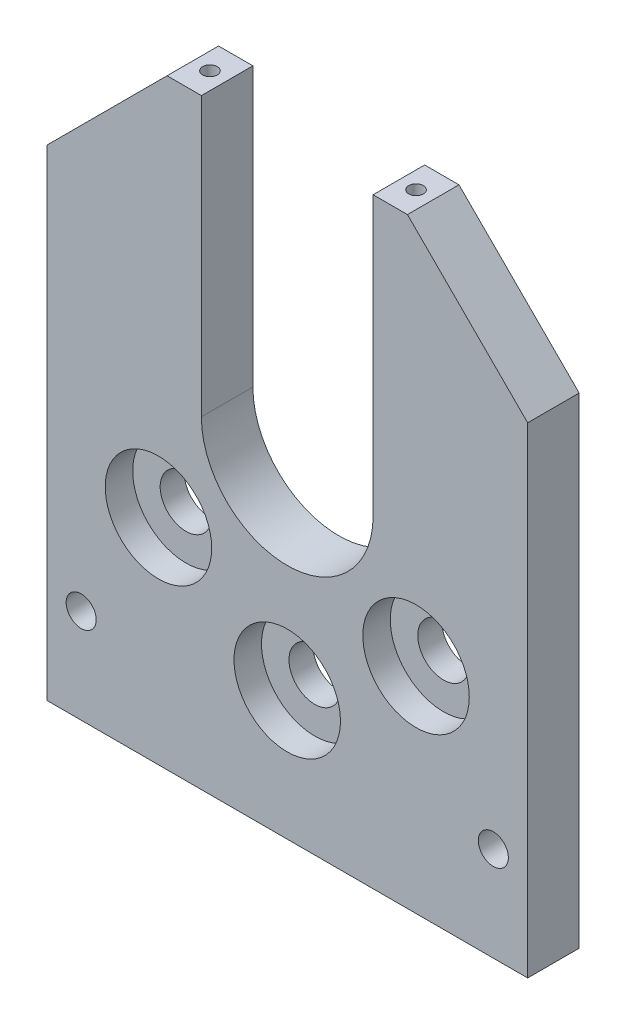
ISO-10303-21;
HEADER;
FILE_DESCRIPTION(('STEP AP214'),'2;1');
FILE_NAME('part.step','',(''),(''),'','','');
FILE_SCHEMA(('AUTOMOTIVE_DESIGN { 1 0 10303 214 1 1 1 1 }'));
ENDSEC;
DATA;
#1=APPLICATION_CONTEXT('core data for automotive mechanical design processes');
#2=APPLICATION_PROTOCOL_DEFINITION('international standard','automotive_design',2000,#1);
#3=PRODUCT_CONTEXT('',#1,'mechanical');
#4=PRODUCT('Part','Part','',(#3));
#5=PRODUCT_RELATED_PRODUCT_CATEGORY('part','',(#4));
#6=PRODUCT_DEFINITION_FORMATION('','',#4);
#7=PRODUCT_DEFINITION_CONTEXT('part definition',#1,'design');
#8=PRODUCT_DEFINITION('design','',#6,#7);
#9=PRODUCT_DEFINITION_SHAPE('','',#8);
#10=(LENGTH_UNIT() NAMED_UNIT(*) SI_UNIT(.MILLI.,.METRE.));
#11=(NAMED_UNIT(*) PLANE_ANGLE_UNIT() SI_UNIT($,.RADIAN.));
#12=(NAMED_UNIT(*) SI_UNIT($,.STERADIAN.) SOLID_ANGLE_UNIT());
#13=UNCERTAINTY_MEASURE_WITH_UNIT(LENGTH_MEASURE(1.E-05),#10,'distance_accuracy_value','');
#14=(GEOMETRIC_REPRESENTATION_CONTEXT(3) GLOBAL_UNCERTAINTY_ASSIGNED_CONTEXT((#13)) GLOBAL_UNIT_ASSIGNED_CONTEXT((#10,
#11,#12)) REPRESENTATION_CONTEXT('',''));
#15=CARTESIAN_POINT('',(0.,0.,0.));
#16=DIRECTION('',(0.,0.,1.));
#17=DIRECTION('',(1.,0.,0.));
#18=AXIS2_PLACEMENT_3D('',#15,#16,#17);
#19=CARTESIAN_POINT('',(0.,75.,-335.));
#20=DIRECTION('',(0.,0.,1.));
#21=DIRECTION('',(1.,0.,0.));
#22=AXIS2_PLACEMENT_3D('',#19,#20,#21);
#23=CYLINDRICAL_SURFACE('',#22,15.);
#24=CARTESIAN_POINT('',(0.,75.,-15.));
#25=DIRECTION('',(0.,0.,-1.));
#26=DIRECTION('',(-1.,0.,0.));
#27=AXIS2_PLACEMENT_3D('',#24,#25,#26);
#28=CIRCLE('',#27,15.);
#29=CARTESIAN_POINT('',(-15.,75.,-15.));
#30=VERTEX_POINT('',#29);
#31=EDGE_CURVE('E226',#30,#30,#28,.T.);
#32=ORIENTED_EDGE('',*,*,#31,.T.);
#33=EDGE_LOOP('',(#32));
#34=FACE_BOUND('',#33,.T.);
#35=CARTESIAN_POINT('',(0.,75.,-1.));
#36=DIRECTION('',(0.,0.,1.));
#37=DIRECTION('',(1.,0.,0.));
#38=AXIS2_PLACEMENT_3D('',#35,#36,#37);
#39=CIRCLE('',#38,15.);
#40=CARTESIAN_POINT('',(15.,75.,-1.));
#41=VERTEX_POINT('',#40);
#42=EDGE_CURVE('E51',#41,#41,#39,.F.);
#43=ORIENTED_EDGE('',*,*,#42,.F.);
#44=EDGE_LOOP('',(#43));
#45=FACE_BOUND('',#44,.T.);
#46=ADVANCED_FACE('F46',(#34,#45),#23,.F.);
#47=CARTESIAN_POINT('',(75.,124.749371855331,-335.));
#48=DIRECTION('',(0.,0.,1.));
#49=DIRECTION('',(1.,0.,0.));
#50=AXIS2_PLACEMENT_3D('',#47,#48,#49);
#51=CYLINDRICAL_SURFACE('',#50,15.);
#52=CARTESIAN_POINT('',(75.,124.749371855331,-15.));
#53=DIRECTION('',(0.,0.,-1.));
#54=DIRECTION('',(-1.,0.,0.));
#55=AXIS2_PLACEMENT_3D('',#52,#53,#54);
#56=CIRCLE('',#55,15.);
#57=CARTESIAN_POINT('',(60.,124.749371855331,-15.));
#58=VERTEX_POINT('',#57);
#59=EDGE_CURVE('E229',#58,#58,#56,.T.);
#60=ORIENTED_EDGE('',*,*,#59,.T.);
#61=EDGE_LOOP('',(#60));
#62=FACE_BOUND('',#61,.T.);
#63=CARTESIAN_POINT('',(75.,124.749371855331,-1.));
#64=DIRECTION('',(0.,0.,1.));
#65=DIRECTION('',(1.,0.,0.));
#66=AXIS2_PLACEMENT_3D('',#63,#64,#65);
#67=CIRCLE('',#66,15.);
#68=CARTESIAN_POINT('',(90.,124.749371855331,-1.));
#69=VERTEX_POINT('',#68);
#70=EDGE_CURVE('E238',#69,#69,#67,.F.);
#71=ORIENTED_EDGE('',*,*,#70,.F.);
#72=EDGE_LOOP('',(#71));
#73=FACE_BOUND('',#72,.T.);
#74=ADVANCED_FACE('F249',(#62,#73),#51,.F.);
#75=CARTESIAN_POINT('',(-75.,124.749371855331,-335.));
#76=DIRECTION('',(0.,0.,1.));
#77=DIRECTION('',(1.,0.,0.));
#78=AXIS2_PLACEMENT_3D('',#75,#76,#77);
#79=CYLINDRICAL_SURFACE('',#78,15.);
#80=CARTESIAN_POINT('',(-75.,124.749371855331,-15.));
#81=DIRECTION('',(0.,0.,-1.));
#82=DIRECTION('',(-1.,0.,0.));
#83=AXIS2_PLACEMENT_3D('',#80,#81,#82);
#84=CIRCLE('',#83,15.);
#85=CARTESIAN_POINT('',(-90.,124.749371855331,-15.));
#86=VERTEX_POINT('',#85);
#87=EDGE_CURVE('E232',#86,#86,#84,.T.);
#88=ORIENTED_EDGE('',*,*,#87,.T.);
#89=EDGE_LOOP('',(#88));
#90=FACE_BOUND('',#89,.T.);
#91=CARTESIAN_POINT('',(-75.,124.749371855331,-1.));
#92=DIRECTION('',(0.,0.,1.));
#93=DIRECTION('',(1.,0.,0.));
#94=AXIS2_PLACEMENT_3D('',#91,#92,#93);
#95=CIRCLE('',#94,15.);
#96=CARTESIAN_POINT('',(-60.,124.749371855331,-1.));
#97=VERTEX_POINT('',#96);
#98=EDGE_CURVE('E236',#97,#97,#95,.F.);
#99=ORIENTED_EDGE('',*,*,#98,.F.);
#100=EDGE_LOOP('',(#99));
#101=FACE_BOUND('',#100,.T.);
#102=ADVANCED_FACE('F255',(#90,#101),#79,.F.);
#103=CARTESIAN_POINT('',(-140.,350.,15.));
#104=DIRECTION('',(0.,0.,-1.));
#105=DIRECTION('',(-1.,0.,0.));
#106=AXIS2_PLACEMENT_3D('',#103,#104,#105);
#107=PLANE('',#106);
#108=CARTESIAN_POINT('',(-75.,124.749371855331,15.));
#109=DIRECTION('',(0.,0.,1.));
#110=DIRECTION('',(1.,0.,0.));
#111=AXIS2_PLACEMENT_3D('',#108,#109,#110);
#112=CIRCLE('',#111,31.);
#113=CARTESIAN_POINT('',(-44.,124.749371855331,15.));
#114=VERTEX_POINT('',#113);
#115=EDGE_CURVE('E532',#114,#114,#112,.T.);
#116=ORIENTED_EDGE('',*,*,#115,.F.);
#117=EDGE_LOOP('',(#116));
#118=FACE_BOUND('',#117,.T.);
#119=CARTESIAN_POINT('',(0.,75.,15.));
#120=DIRECTION('',(0.,0.,1.));
#121=DIRECTION('',(1.,0.,0.));
#122=AXIS2_PLACEMENT_3D('',#119,#120,#121);
#123=CIRCLE('',#122,31.);
#124=CARTESIAN_POINT('',(31.,75.,15.));
#125=VERTEX_POINT('',#124);
#126=EDGE_CURVE('E528',#125,#125,#123,.T.);
#127=ORIENTED_EDGE('',*,*,#126,.F.);
#128=EDGE_LOOP('',(#127));
#129=FACE_BOUND('',#128,.T.);
#130=CARTESIAN_POINT('',(75.,124.749371855331,15.));
#131=DIRECTION('',(0.,0.,1.));
#132=DIRECTION('',(1.,0.,0.));
#133=AXIS2_PLACEMENT_3D('',#130,#131,#132);
#134=CIRCLE('',#133,31.);
#135=CARTESIAN_POINT('',(106.,124.749371855331,15.));
#136=VERTEX_POINT('',#135);
#137=EDGE_CURVE('E535',#136,#136,#134,.T.);
#138=ORIENTED_EDGE('',*,*,#137,.F.);
#139=EDGE_LOOP('',(#138));
#140=FACE_BOUND('',#139,.T.);
#141=CARTESIAN_POINT('',(-120.,55.,15.));
#142=DIRECTION('',(0.,0.,1.));
#143=DIRECTION('',(1.,0.,0.));
#144=AXIS2_PLACEMENT_3D('',#141,#142,#143);
#145=CIRCLE('',#144,8.75000000000001);
#146=CARTESIAN_POINT('',(-111.25,55.,15.));
#147=VERTEX_POINT('',#146);
#148=EDGE_CURVE('E223',#147,#147,#145,.T.);
#149=ORIENTED_EDGE('',*,*,#148,.F.);
#150=EDGE_LOOP('',(#149));
#151=FACE_BOUND('',#150,.T.);
#152=CARTESIAN_POINT('',(120.,55.,15.));
#153=DIRECTION('',(0.,0.,1.));
#154=DIRECTION('',(1.,0.,0.));
#155=AXIS2_PLACEMENT_3D('',#152,#153,#154);
#156=CIRCLE('',#155,8.74999999999998);
#157=CARTESIAN_POINT('',(128.75,55.,15.));
#158=VERTEX_POINT('',#157);
#159=EDGE_CURVE('E235',#158,#158,#156,.T.);
#160=ORIENTED_EDGE('',*,*,#159,.F.);
#161=EDGE_LOOP('',(#160));
#162=FACE_BOUND('',#161,.T.);
#163=DIRECTION('',(1.,0.,0.));
#164=VECTOR('',#163,1.);
#165=CARTESIAN_POINT('',(-140.,350.,15.));
#166=LINE('',#165,#164);
#167=CARTESIAN_POINT('',(-70.,350.,15.));
#168=VERTEX_POINT('',#167);
#169=CARTESIAN_POINT('',(-50.,350.,15.));
#170=VERTEX_POINT('',#169);
#171=EDGE_CURVE('E173',#168,#170,#166,.T.);
#172=ORIENTED_EDGE('',*,*,#171,.F.);
#173=DIRECTION('',(-0.707106781186546,-0.707106781186549,0.));
#174=VECTOR('',#173,1.);
#175=CARTESIAN_POINT('',(-70.,350.,15.));
#176=LINE('',#175,#174);
#177=CARTESIAN_POINT('',(-140.,280.,15.));
#178=VERTEX_POINT('',#177);
#179=EDGE_CURVE('E211',#168,#178,#176,.T.);
#180=ORIENTED_EDGE('',*,*,#179,.T.);
#181=DIRECTION('',(0.,-1.,0.));
#182=VECTOR('',#181,1.);
#183=CARTESIAN_POINT('',(-140.,350.,15.));
#184=LINE('',#183,#182);
#185=CARTESIAN_POINT('',(-140.,0.,15.));
#186=VERTEX_POINT('',#185);
#187=EDGE_CURVE('E196',#178,#186,#184,.T.);
#188=ORIENTED_EDGE('',*,*,#187,.T.);
#189=DIRECTION('',(1.,0.,0.));
#190=VECTOR('',#189,1.);
#191=CARTESIAN_POINT('',(-140.,0.,15.));
#192=LINE('',#191,#190);
#193=CARTESIAN_POINT('',(140.,0.,15.));
#194=VERTEX_POINT('',#193);
#195=EDGE_CURVE('E182',#186,#194,#192,.T.);
#196=ORIENTED_EDGE('',*,*,#195,.T.);
#197=DIRECTION('',(0.,-1.,0.));
#198=VECTOR('',#197,1.);
#199=CARTESIAN_POINT('',(140.,350.,15.));
#200=LINE('',#199,#198);
#201=CARTESIAN_POINT('',(140.,280.,15.));
#202=VERTEX_POINT('',#201);
#203=EDGE_CURVE('E194',#202,#194,#200,.T.);
#204=ORIENTED_EDGE('',*,*,#203,.F.);
#205=DIRECTION('',(0.707106781186548,-0.707106781186547,0.));
#206=VECTOR('',#205,1.);
#207=CARTESIAN_POINT('',(140.,280.,15.));
#208=LINE('',#207,#206);
#209=CARTESIAN_POINT('',(69.9999999999998,350.,15.));
#210=VERTEX_POINT('',#209);
#211=EDGE_CURVE('E209',#202,#210,#208,.F.);
#212=ORIENTED_EDGE('',*,*,#211,.T.);
#213=CARTESIAN_POINT('',(50.,350.,15.));
#214=VERTEX_POINT('',#213);
#215=EDGE_CURVE('E176',#214,#210,#166,.T.);
#216=ORIENTED_EDGE('',*,*,#215,.F.);
#217=DIRECTION('',(0.,-1.,0.));
#218=VECTOR('',#217,1.);
#219=CARTESIAN_POINT('',(50.,0.,15.));
#220=LINE('',#219,#218);
#221=CARTESIAN_POINT('',(50.,188.,15.));
#222=VERTEX_POINT('',#221);
#223=EDGE_CURVE('E159',#214,#222,#220,.T.);
#224=ORIENTED_EDGE('',*,*,#223,.T.);
#225=CARTESIAN_POINT('',(0.,188.,15.));
#226=DIRECTION('',(0.,0.,1.));
#227=DIRECTION('',(1.,0.,0.));
#228=AXIS2_PLACEMENT_3D('',#225,#226,#227);
#229=CIRCLE('',#228,50.);
#230=CARTESIAN_POINT('',(-50.,188.,15.));
#231=VERTEX_POINT('',#230);
#232=EDGE_CURVE('E156',#231,#222,#229,.T.);
#233=ORIENTED_EDGE('',*,*,#232,.F.);
#234=DIRECTION('',(0.,-1.,0.));
#235=VECTOR('',#234,1.);
#236=CARTESIAN_POINT('',(-50.,0.,15.));
#237=LINE('',#236,#235);
#238=EDGE_CURVE('E153',#170,#231,#237,.T.);
#239=ORIENTED_EDGE('',*,*,#238,.F.);
#240=EDGE_LOOP('',(#172,#180,#188,#196,#204,#212,#216,#224,#233,#239));
#241=FACE_BOUND('',#240,.T.);
#242=ADVANCED_FACE('F304',(#118,#129,#140,#151,#162,#241),#107,.F.);
#243=CARTESIAN_POINT('',(-140.,350.,-15.));
#244=DIRECTION('',(0.,0.,-1.));
#245=DIRECTION('',(-1.,0.,0.));
#246=AXIS2_PLACEMENT_3D('',#243,#244,#245);
#247=PLANE('',#246);
#248=ORIENTED_EDGE('',*,*,#87,.F.);
#249=EDGE_LOOP('',(#248));
#250=FACE_BOUND('',#249,.T.);
#251=ORIENTED_EDGE('',*,*,#59,.F.);
#252=EDGE_LOOP('',(#251));
#253=FACE_BOUND('',#252,.T.);
#254=ORIENTED_EDGE('',*,*,#31,.F.);
#255=EDGE_LOOP('',(#254));
#256=FACE_BOUND('',#255,.T.);
#257=CARTESIAN_POINT('',(-120.,55.,-15.));
#258=DIRECTION('',(0.,0.,-1.));
#259=DIRECTION('',(-1.,0.,0.));
#260=AXIS2_PLACEMENT_3D('',#257,#258,#259);
#261=CIRCLE('',#260,8.75000000000001);
#262=CARTESIAN_POINT('',(-128.75,55.,-15.));
#263=VERTEX_POINT('',#262);
#264=EDGE_CURVE('E147',#263,#263,#261,.T.);
#265=ORIENTED_EDGE('',*,*,#264,.F.);
#266=EDGE_LOOP('',(#265));
#267=FACE_BOUND('',#266,.T.);
#268=CARTESIAN_POINT('',(120.,55.,-15.));
#269=DIRECTION('',(0.,0.,-1.));
#270=DIRECTION('',(-1.,0.,0.));
#271=AXIS2_PLACEMENT_3D('',#268,#269,#270);
#272=CIRCLE('',#271,8.74999999999998);
#273=CARTESIAN_POINT('',(111.25,55.,-15.));
#274=VERTEX_POINT('',#273);
#275=EDGE_CURVE('E220',#274,#274,#272,.T.);
#276=ORIENTED_EDGE('',*,*,#275,.F.);
#277=EDGE_LOOP('',(#276));
#278=FACE_BOUND('',#277,.T.);
#279=DIRECTION('',(0.,-1.,0.));
#280=VECTOR('',#279,1.);
#281=CARTESIAN_POINT('',(-140.,350.,-15.));
#282=LINE('',#281,#280);
#283=CARTESIAN_POINT('',(-140.,280.,-15.));
#284=VERTEX_POINT('',#283);
#285=CARTESIAN_POINT('',(-140.,0.,-15.));
#286=VERTEX_POINT('',#285);
#287=EDGE_CURVE('E179',#284,#286,#282,.T.);
#288=ORIENTED_EDGE('',*,*,#287,.F.);
#289=DIRECTION('',(0.707106781186546,0.707106781186549,0.));
#290=VECTOR('',#289,1.);
#291=CARTESIAN_POINT('',(-105.,315.,-15.));
#292=LINE('',#291,#290);
#293=CARTESIAN_POINT('',(-70.,350.,-15.));
#294=VERTEX_POINT('',#293);
#295=EDGE_CURVE('E216',#284,#294,#292,.T.);
#296=ORIENTED_EDGE('',*,*,#295,.T.);
#297=DIRECTION('',(1.,0.,0.));
#298=VECTOR('',#297,1.);
#299=CARTESIAN_POINT('',(-140.,350.,-15.));
#300=LINE('',#299,#298);
#301=CARTESIAN_POINT('',(-50.,350.,-15.));
#302=VERTEX_POINT('',#301);
#303=EDGE_CURVE('E177',#294,#302,#300,.T.);
#304=ORIENTED_EDGE('',*,*,#303,.T.);
#305=DIRECTION('',(0.,1.,0.));
#306=VECTOR('',#305,1.);
#307=CARTESIAN_POINT('',(-50.,350.,-15.));
#308=LINE('',#307,#306);
#309=CARTESIAN_POINT('',(-50.,188.,-15.));
#310=VERTEX_POINT('',#309);
#311=EDGE_CURVE('E165',#310,#302,#308,.T.);
#312=ORIENTED_EDGE('',*,*,#311,.F.);
#313=CARTESIAN_POINT('',(0.,188.,-15.));
#314=DIRECTION('',(0.,0.,-1.));
#315=DIRECTION('',(-1.,0.,0.));
#316=AXIS2_PLACEMENT_3D('',#313,#314,#315);
#317=CIRCLE('',#316,50.);
#318=CARTESIAN_POINT('',(50.,188.,-15.));
#319=VERTEX_POINT('',#318);
#320=EDGE_CURVE('E204',#319,#310,#317,.T.);
#321=ORIENTED_EDGE('',*,*,#320,.F.);
#322=DIRECTION('',(0.,1.,0.));
#323=VECTOR('',#322,1.);
#324=CARTESIAN_POINT('',(50.,350.,-15.));
#325=LINE('',#324,#323);
#326=CARTESIAN_POINT('',(50.,350.,-15.));
#327=VERTEX_POINT('',#326);
#328=EDGE_CURVE('E169',#319,#327,#325,.T.);
#329=ORIENTED_EDGE('',*,*,#328,.T.);
#330=CARTESIAN_POINT('',(69.9999999999998,350.,-15.));
#331=VERTEX_POINT('',#330);
#332=EDGE_CURVE('E175',#327,#331,#300,.T.);
#333=ORIENTED_EDGE('',*,*,#332,.T.);
#334=DIRECTION('',(-0.707106781186548,0.707106781186547,0.));
#335=VECTOR('',#334,1.);
#336=CARTESIAN_POINT('',(-35.0000000000003,455.,-15.));
#337=LINE('',#336,#335);
#338=CARTESIAN_POINT('',(140.,280.,-15.));
#339=VERTEX_POINT('',#338);
#340=EDGE_CURVE('E64',#331,#339,#337,.F.);
#341=ORIENTED_EDGE('',*,*,#340,.T.);
#342=DIRECTION('',(0.,-1.,0.));
#343=VECTOR('',#342,1.);
#344=CARTESIAN_POINT('',(140.,350.,-15.));
#345=LINE('',#344,#343);
#346=CARTESIAN_POINT('',(140.,0.,-15.));
#347=VERTEX_POINT('',#346);
#348=EDGE_CURVE('E192',#339,#347,#345,.T.);
#349=ORIENTED_EDGE('',*,*,#348,.T.);
#350=DIRECTION('',(1.,0.,0.));
#351=VECTOR('',#350,1.);
#352=CARTESIAN_POINT('',(-140.,0.,-15.));
#353=LINE('',#352,#351);
#354=EDGE_CURVE('E188',#286,#347,#353,.T.);
#355=ORIENTED_EDGE('',*,*,#354,.F.);
#356=EDGE_LOOP('',(#288,#296,#304,#312,#321,#329,#333,#341,#349,#355));
#357=FACE_BOUND('',#356,.T.);
#358=ADVANCED_FACE('F301',(#250,#253,#256,#267,#278,#357),#247,.T.);
#359=CARTESIAN_POINT('',(0.,350.,0.));
#360=DIRECTION('',(0.,1.,0.));
#361=DIRECTION('',(0.,0.,1.));
#362=AXIS2_PLACEMENT_3D('',#359,#360,#361);
#363=PLANE('',#362);
#364=CARTESIAN_POINT('',(60.,350.,0.));
#365=DIRECTION('',(0.,1.,0.));
#366=DIRECTION('',(0.,0.,1.));
#367=AXIS2_PLACEMENT_3D('',#364,#365,#366);
#368=CIRCLE('',#367,4.25);
#369=CARTESIAN_POINT('',(60.,350.,4.25));
#370=VERTEX_POINT('',#369);
#371=EDGE_CURVE('E140',#370,#370,#368,.T.);
#372=ORIENTED_EDGE('',*,*,#371,.F.);
#373=EDGE_LOOP('',(#372));
#374=FACE_BOUND('',#373,.T.);
#375=ORIENTED_EDGE('',*,*,#215,.T.);
#376=DIRECTION('',(0.,0.,-1.));
#377=VECTOR('',#376,1.);
#378=CARTESIAN_POINT('',(69.9999999999998,350.,0.));
#379=LINE('',#378,#377);
#380=EDGE_CURVE('E11',#210,#331,#379,.T.);
#381=ORIENTED_EDGE('',*,*,#380,.T.);
#382=ORIENTED_EDGE('',*,*,#332,.F.);
#383=DIRECTION('',(0.,0.,1.));
#384=VECTOR('',#383,1.);
#385=CARTESIAN_POINT('',(50.,350.,0.));
#386=LINE('',#385,#384);
#387=EDGE_CURVE('E201',#327,#214,#386,.T.);
#388=ORIENTED_EDGE('',*,*,#387,.T.);
#389=EDGE_LOOP('',(#375,#381,#382,#388));
#390=FACE_BOUND('',#389,.T.);
#391=ADVANCED_FACE('F297',(#374,#390),#363,.T.);
#392=CARTESIAN_POINT('',(-140.,350.,-15.));
#393=DIRECTION('',(1.,0.,0.));
#394=DIRECTION('',(0.,0.,-1.));
#395=AXIS2_PLACEMENT_3D('',#392,#393,#394);
#396=PLANE('',#395);
#397=ORIENTED_EDGE('',*,*,#187,.F.);
#398=DIRECTION('',(0.,0.,-1.));
#399=VECTOR('',#398,1.);
#400=CARTESIAN_POINT('',(-140.,280.,-15.));
#401=LINE('',#400,#399);
#402=EDGE_CURVE('E213',#178,#284,#401,.T.);
#403=ORIENTED_EDGE('',*,*,#402,.T.);
#404=ORIENTED_EDGE('',*,*,#287,.T.);
#405=DIRECTION('',(0.,0.,1.));
#406=VECTOR('',#405,1.);
#407=CARTESIAN_POINT('',(-140.,0.,-15.));
#408=LINE('',#407,#406);
#409=EDGE_CURVE('E172',#286,#186,#408,.T.);
#410=ORIENTED_EDGE('',*,*,#409,.T.);
#411=EDGE_LOOP('',(#397,#403,#404,#410));
#412=FACE_BOUND('',#411,.T.);
#413=ADVANCED_FACE('F308',(#412),#396,.F.);
#414=CARTESIAN_POINT('',(140.,350.,-15.));
#415=DIRECTION('',(1.,0.,0.));
#416=DIRECTION('',(0.,0.,-1.));
#417=AXIS2_PLACEMENT_3D('',#414,#415,#416);
#418=PLANE('',#417);
#419=ORIENTED_EDGE('',*,*,#348,.F.);
#420=DIRECTION('',(0.,0.,1.));
#421=VECTOR('',#420,1.);
#422=CARTESIAN_POINT('',(140.,280.,-15.));
#423=LINE('',#422,#421);
#424=EDGE_CURVE('E56',#339,#202,#423,.T.);
#425=ORIENTED_EDGE('',*,*,#424,.T.);
#426=ORIENTED_EDGE('',*,*,#203,.T.);
#427=DIRECTION('',(0.,0.,1.));
#428=VECTOR('',#427,1.);
#429=CARTESIAN_POINT('',(140.,0.,-15.));
#430=LINE('',#429,#428);
#431=EDGE_CURVE('E185',#347,#194,#430,.T.);
#432=ORIENTED_EDGE('',*,*,#431,.F.);
#433=EDGE_LOOP('',(#419,#425,#426,#432));
#434=FACE_BOUND('',#433,.T.);
#435=ADVANCED_FACE('F295',(#434),#418,.T.);
#436=CARTESIAN_POINT('',(-60.,350.,0.));
#437=DIRECTION('',(0.,1.,0.));
#438=DIRECTION('',(0.,0.,1.));
#439=AXIS2_PLACEMENT_3D('',#436,#437,#438);
#440=CIRCLE('',#439,4.25);
#441=CARTESIAN_POINT('',(-60.,350.,4.25));
#442=VERTEX_POINT('',#441);
#443=EDGE_CURVE('E141',#442,#442,#440,.T.);
#444=ORIENTED_EDGE('',*,*,#443,.F.);
#445=EDGE_LOOP('',(#444));
#446=FACE_BOUND('',#445,.T.);
#447=ORIENTED_EDGE('',*,*,#303,.F.);
#448=DIRECTION('',(0.,0.,1.));
#449=VECTOR('',#448,1.);
#450=CARTESIAN_POINT('',(-70.,350.,15.));
#451=LINE('',#450,#449);
#452=EDGE_CURVE('E206',#294,#168,#451,.T.);
#453=ORIENTED_EDGE('',*,*,#452,.T.);
#454=ORIENTED_EDGE('',*,*,#171,.T.);
#455=DIRECTION('',(0.,0.,1.));
#456=VECTOR('',#455,1.);
#457=CARTESIAN_POINT('',(-50.,350.,0.));
#458=LINE('',#457,#456);
#459=EDGE_CURVE('E198',#302,#170,#458,.T.);
#460=ORIENTED_EDGE('',*,*,#459,.F.);
#461=EDGE_LOOP('',(#447,#453,#454,#460));
#462=FACE_BOUND('',#461,.T.);
#463=ADVANCED_FACE('F292',(#446,#462),#363,.T.);
#464=CARTESIAN_POINT('',(0.,0.,0.));
#465=DIRECTION('',(0.,1.,0.));
#466=DIRECTION('',(0.,0.,1.));
#467=AXIS2_PLACEMENT_3D('',#464,#465,#466);
#468=PLANE('',#467);
#469=ORIENTED_EDGE('',*,*,#409,.F.);
#470=ORIENTED_EDGE('',*,*,#354,.T.);
#471=ORIENTED_EDGE('',*,*,#431,.T.);
#472=ORIENTED_EDGE('',*,*,#195,.F.);
#473=EDGE_LOOP('',(#469,#470,#471,#472));
#474=FACE_BOUND('',#473,.T.);
#475=ADVANCED_FACE('F282',(#474),#468,.F.);
#476=CARTESIAN_POINT('',(50.,0.,-335.));
#477=DIRECTION('',(-1.,0.,0.));
#478=DIRECTION('',(0.,0.,1.));
#479=AXIS2_PLACEMENT_3D('',#476,#477,#478);
#480=PLANE('',#479);
#481=DIRECTION('',(0.,0.,1.));
#482=VECTOR('',#481,1.);
#483=CARTESIAN_POINT('',(50.,188.,-335.));
#484=LINE('',#483,#482);
#485=EDGE_CURVE('E163',#319,#222,#484,.T.);
#486=ORIENTED_EDGE('',*,*,#485,.T.);
#487=ORIENTED_EDGE('',*,*,#223,.F.);
#488=ORIENTED_EDGE('',*,*,#387,.F.);
#489=ORIENTED_EDGE('',*,*,#328,.F.);
#490=EDGE_LOOP('',(#486,#487,#488,#489));
#491=FACE_BOUND('',#490,.T.);
#492=ADVANCED_FACE('F278',(#491),#480,.T.);
#493=CARTESIAN_POINT('',(0.,188.,-335.));
#494=DIRECTION('',(0.,0.,1.));
#495=DIRECTION('',(1.,0.,0.));
#496=AXIS2_PLACEMENT_3D('',#493,#494,#495);
#497=CYLINDRICAL_SURFACE('',#496,50.);
#498=ORIENTED_EDGE('',*,*,#320,.T.);
#499=DIRECTION('',(0.,0.,1.));
#500=VECTOR('',#499,1.);
#501=CARTESIAN_POINT('',(-50.,188.,-335.));
#502=LINE('',#501,#500);
#503=EDGE_CURVE('E162',#310,#231,#502,.T.);
#504=ORIENTED_EDGE('',*,*,#503,.T.);
#505=ORIENTED_EDGE('',*,*,#232,.T.);
#506=ORIENTED_EDGE('',*,*,#485,.F.);
#507=EDGE_LOOP('',(#498,#504,#505,#506));
#508=FACE_BOUND('',#507,.T.);
#509=ADVANCED_FACE('F281',(#508),#497,.F.);
#510=CARTESIAN_POINT('',(-50.,0.,-335.));
#511=DIRECTION('',(-1.,0.,0.));
#512=DIRECTION('',(0.,0.,1.));
#513=AXIS2_PLACEMENT_3D('',#510,#511,#512);
#514=PLANE('',#513);
#515=ORIENTED_EDGE('',*,*,#311,.T.);
#516=ORIENTED_EDGE('',*,*,#459,.T.);
#517=ORIENTED_EDGE('',*,*,#238,.T.);
#518=ORIENTED_EDGE('',*,*,#503,.F.);
#519=EDGE_LOOP('',(#515,#516,#517,#518));
#520=FACE_BOUND('',#519,.T.);
#521=ADVANCED_FACE('F286',(#520),#514,.F.);
#522=CARTESIAN_POINT('',(-70.,350.,0.));
#523=DIRECTION('',(-0.707106781186549,0.707106781186546,0.));
#524=DIRECTION('',(0.,0.,-1.));
#525=AXIS2_PLACEMENT_3D('',#522,#523,#524);
#526=PLANE('',#525);
#527=ORIENTED_EDGE('',*,*,#295,.F.);
#528=ORIENTED_EDGE('',*,*,#402,.F.);
#529=ORIENTED_EDGE('',*,*,#179,.F.);
#530=ORIENTED_EDGE('',*,*,#452,.F.);
#531=EDGE_LOOP('',(#527,#528,#529,#530));
#532=FACE_BOUND('',#531,.T.);
#533=ADVANCED_FACE('F290',(#532),#526,.T.);
#534=CARTESIAN_POINT('',(140.,280.,-15.));
#535=DIRECTION('',(-0.707106781186547,-0.707106781186548,0.));
#536=DIRECTION('',(0.,0.,1.));
#537=AXIS2_PLACEMENT_3D('',#534,#535,#536);
#538=PLANE('',#537);
#539=ORIENTED_EDGE('',*,*,#340,.F.);
#540=ORIENTED_EDGE('',*,*,#380,.F.);
#541=ORIENTED_EDGE('',*,*,#211,.F.);
#542=ORIENTED_EDGE('',*,*,#424,.F.);
#543=EDGE_LOOP('',(#539,#540,#541,#542));
#544=FACE_BOUND('',#543,.T.);
#545=ADVANCED_FACE('F49',(#544),#538,.F.);
#546=CARTESIAN_POINT('',(60.,326.,0.));
#547=DIRECTION('',(0.,1.,0.));
#548=DIRECTION('',(0.,0.,1.));
#549=AXIS2_PLACEMENT_3D('',#546,#547,#548);
#550=CONICAL_SURFACE('',#549,4.24999999999999,0.785398163397449);
#551=CARTESIAN_POINT('',(60.,321.75,0.));
#552=VERTEX_POINT('',#551);
#553=VERTEX_LOOP('',#552);
#554=FACE_BOUND('',#553,.T.);
#555=CARTESIAN_POINT('',(60.,326.,0.));
#556=DIRECTION('',(0.,1.,0.));
#557=DIRECTION('',(0.,0.,1.));
#558=AXIS2_PLACEMENT_3D('',#555,#556,#557);
#559=CIRCLE('',#558,4.24999999999999);
#560=CARTESIAN_POINT('',(60.,326.,4.24999999999999));
#561=VERTEX_POINT('',#560);
#562=EDGE_CURVE('E144',#561,#561,#559,.T.);
#563=ORIENTED_EDGE('',*,*,#562,.T.);
#564=EDGE_LOOP('',(#563));
#565=FACE_BOUND('',#564,.T.);
#566=ADVANCED_FACE('F273',(#554,#565),#550,.F.);
#567=CARTESIAN_POINT('',(60.,350.,0.));
#568=DIRECTION('',(0.,1.,0.));
#569=DIRECTION('',(0.,0.,1.));
#570=AXIS2_PLACEMENT_3D('',#567,#568,#569);
#571=CYLINDRICAL_SURFACE('',#570,4.25);
#572=ORIENTED_EDGE('',*,*,#562,.F.);
#573=EDGE_LOOP('',(#572));
#574=FACE_BOUND('',#573,.T.);
#575=ORIENTED_EDGE('',*,*,#371,.T.);
#576=EDGE_LOOP('',(#575));
#577=FACE_BOUND('',#576,.T.);
#578=ADVANCED_FACE('F134',(#574,#577),#571,.F.);
#579=CARTESIAN_POINT('',(-60.,326.,0.));
#580=DIRECTION('',(0.,1.,0.));
#581=DIRECTION('',(0.,0.,1.));
#582=AXIS2_PLACEMENT_3D('',#579,#580,#581);
#583=CONICAL_SURFACE('',#582,4.25,0.78539816339745);
#584=CARTESIAN_POINT('',(-60.,321.75,0.));
#585=VERTEX_POINT('',#584);
#586=VERTEX_LOOP('',#585);
#587=FACE_BOUND('',#586,.T.);
#588=CARTESIAN_POINT('',(-60.,326.,0.));
#589=DIRECTION('',(0.,1.,0.));
#590=DIRECTION('',(0.,0.,1.));
#591=AXIS2_PLACEMENT_3D('',#588,#589,#590);
#592=CIRCLE('',#591,4.25);
#593=CARTESIAN_POINT('',(-60.,326.,4.25));
#594=VERTEX_POINT('',#593);
#595=EDGE_CURVE('E138',#594,#594,#592,.T.);
#596=ORIENTED_EDGE('',*,*,#595,.T.);
#597=EDGE_LOOP('',(#596));
#598=FACE_BOUND('',#597,.T.);
#599=ADVANCED_FACE('F130',(#587,#598),#583,.F.);
#600=CARTESIAN_POINT('',(-60.,350.,0.));
#601=DIRECTION('',(0.,1.,0.));
#602=DIRECTION('',(0.,0.,1.));
#603=AXIS2_PLACEMENT_3D('',#600,#601,#602);
#604=CYLINDRICAL_SURFACE('',#603,4.25);
#605=ORIENTED_EDGE('',*,*,#595,.F.);
#606=EDGE_LOOP('',(#605));
#607=FACE_BOUND('',#606,.T.);
#608=ORIENTED_EDGE('',*,*,#443,.T.);
#609=EDGE_LOOP('',(#608));
#610=FACE_BOUND('',#609,.T.);
#611=ADVANCED_FACE('F133',(#607,#610),#604,.F.);
#612=CARTESIAN_POINT('',(120.,55.,-335.));
#613=DIRECTION('',(0.,0.,1.));
#614=DIRECTION('',(1.,0.,0.));
#615=AXIS2_PLACEMENT_3D('',#612,#613,#614);
#616=CYLINDRICAL_SURFACE('',#615,8.74999999999998);
#617=ORIENTED_EDGE('',*,*,#275,.T.);
#618=EDGE_LOOP('',(#617));
#619=FACE_BOUND('',#618,.T.);
#620=ORIENTED_EDGE('',*,*,#159,.T.);
#621=EDGE_LOOP('',(#620));
#622=FACE_BOUND('',#621,.T.);
#623=ADVANCED_FACE('F264',(#619,#622),#616,.F.);
#624=CARTESIAN_POINT('',(-120.,55.,-335.));
#625=DIRECTION('',(0.,0.,1.));
#626=DIRECTION('',(1.,0.,0.));
#627=AXIS2_PLACEMENT_3D('',#624,#625,#626);
#628=CYLINDRICAL_SURFACE('',#627,8.75000000000001);
#629=ORIENTED_EDGE('',*,*,#264,.T.);
#630=EDGE_LOOP('',(#629));
#631=FACE_BOUND('',#630,.T.);
#632=ORIENTED_EDGE('',*,*,#148,.T.);
#633=EDGE_LOOP('',(#632));
#634=FACE_BOUND('',#633,.T.);
#635=ADVANCED_FACE('F260',(#631,#634),#628,.F.);
#636=CARTESIAN_POINT('',(-75.,124.749371855331,-1.));
#637=DIRECTION('',(0.,0.,1.));
#638=DIRECTION('',(1.,0.,0.));
#639=AXIS2_PLACEMENT_3D('',#636,#637,#638);
#640=PLANE('',#639);
#641=CARTESIAN_POINT('',(-75.,124.749371855331,-1.));
#642=DIRECTION('',(0.,0.,1.));
#643=DIRECTION('',(1.,0.,0.));
#644=AXIS2_PLACEMENT_3D('',#641,#642,#643);
#645=CIRCLE('',#644,31.);
#646=CARTESIAN_POINT('',(-44.,124.749371855331,-1.));
#647=VERTEX_POINT('',#646);
#648=EDGE_CURVE('E239',#647,#647,#645,.T.);
#649=ORIENTED_EDGE('',*,*,#648,.T.);
#650=EDGE_LOOP('',(#649));
#651=FACE_BOUND('',#650,.T.);
#652=ORIENTED_EDGE('',*,*,#98,.T.);
#653=EDGE_LOOP('',(#652));
#654=FACE_BOUND('',#653,.T.);
#655=ADVANCED_FACE('F263',(#651,#654),#640,.T.);
#656=CARTESIAN_POINT('',(-75.,124.749371855331,-1.));
#657=DIRECTION('',(0.,0.,1.));
#658=DIRECTION('',(1.,0.,0.));
#659=AXIS2_PLACEMENT_3D('',#656,#657,#658);
#660=CYLINDRICAL_SURFACE('',#659,31.);
#661=ORIENTED_EDGE('',*,*,#648,.F.);
#662=EDGE_LOOP('',(#661));
#663=FACE_BOUND('',#662,.T.);
#664=ORIENTED_EDGE('',*,*,#115,.T.);
#665=EDGE_LOOP('',(#664));
#666=FACE_BOUND('',#665,.T.);
#667=ADVANCED_FACE('F456',(#663,#666),#660,.F.);
#668=CARTESIAN_POINT('',(75.,124.749371855331,-1.));
#669=DIRECTION('',(0.,0.,1.));
#670=DIRECTION('',(1.,0.,0.));
#671=AXIS2_PLACEMENT_3D('',#668,#669,#670);
#672=PLANE('',#671);
#673=CARTESIAN_POINT('',(75.,124.749371855331,-1.));
#674=DIRECTION('',(0.,0.,1.));
#675=DIRECTION('',(1.,0.,0.));
#676=AXIS2_PLACEMENT_3D('',#673,#674,#675);
#677=CIRCLE('',#676,31.);
#678=CARTESIAN_POINT('',(106.,124.749371855331,-1.));
#679=VERTEX_POINT('',#678);
#680=EDGE_CURVE('E530',#679,#679,#677,.T.);
#681=ORIENTED_EDGE('',*,*,#680,.T.);
#682=EDGE_LOOP('',(#681));
#683=FACE_BOUND('',#682,.T.);
#684=ORIENTED_EDGE('',*,*,#70,.T.);
#685=EDGE_LOOP('',(#684));
#686=FACE_BOUND('',#685,.T.);
#687=ADVANCED_FACE('F465',(#683,#686),#672,.T.);
#688=CARTESIAN_POINT('',(75.,124.749371855331,-1.));
#689=DIRECTION('',(0.,0.,1.));
#690=DIRECTION('',(1.,0.,0.));
#691=AXIS2_PLACEMENT_3D('',#688,#689,#690);
#692=CYLINDRICAL_SURFACE('',#691,31.);
#693=ORIENTED_EDGE('',*,*,#680,.F.);
#694=EDGE_LOOP('',(#693));
#695=FACE_BOUND('',#694,.T.);
#696=ORIENTED_EDGE('',*,*,#137,.T.);
#697=EDGE_LOOP('',(#696));
#698=FACE_BOUND('',#697,.T.);
#699=ADVANCED_FACE('F474',(#695,#698),#692,.F.);
#700=CARTESIAN_POINT('',(0.,75.,-1.));
#701=DIRECTION('',(0.,0.,1.));
#702=DIRECTION('',(1.,0.,0.));
#703=AXIS2_PLACEMENT_3D('',#700,#701,#702);
#704=PLANE('',#703);
#705=CARTESIAN_POINT('',(0.,75.,-1.));
#706=DIRECTION('',(0.,0.,1.));
#707=DIRECTION('',(1.,0.,0.));
#708=AXIS2_PLACEMENT_3D('',#705,#706,#707);
#709=CIRCLE('',#708,31.);
#710=CARTESIAN_POINT('',(31.,75.,-1.));
#711=VERTEX_POINT('',#710);
#712=EDGE_CURVE('E525',#711,#711,#709,.T.);
#713=ORIENTED_EDGE('',*,*,#712,.T.);
#714=EDGE_LOOP('',(#713));
#715=FACE_BOUND('',#714,.T.);
#716=ORIENTED_EDGE('',*,*,#42,.T.);
#717=EDGE_LOOP('',(#716));
#718=FACE_BOUND('',#717,.T.);
#719=ADVANCED_FACE('F246',(#715,#718),#704,.T.);
#720=CARTESIAN_POINT('',(0.,75.,-1.));
#721=DIRECTION('',(0.,0.,1.));
#722=DIRECTION('',(1.,0.,0.));
#723=AXIS2_PLACEMENT_3D('',#720,#721,#722);
#724=CYLINDRICAL_SURFACE('',#723,31.);
#725=ORIENTED_EDGE('',*,*,#712,.F.);
#726=EDGE_LOOP('',(#725));
#727=FACE_BOUND('',#726,.T.);
#728=ORIENTED_EDGE('',*,*,#126,.T.);
#729=EDGE_LOOP('',(#728));
#730=FACE_BOUND('',#729,.T.);
#731=ADVANCED_FACE('F491',(#727,#730),#724,.F.);
#732=CLOSED_SHELL('',(#46,#74,#102,#242,#358,#391,#413,#435,#463,#475,#492,#509,#521,#533,#545,
#566,#578,#599,#611,#623,#635,#655,#667,#687,#699,#719,#731));
#733=MANIFOLD_SOLID_BREP('B2',#732);
#734=ADVANCED_BREP_SHAPE_REPRESENTATION('',(#18,#733),#14);
#735=SHAPE_DEFINITION_REPRESENTATION(#9,#734);
ENDSEC;
END-ISO-10303-21;
